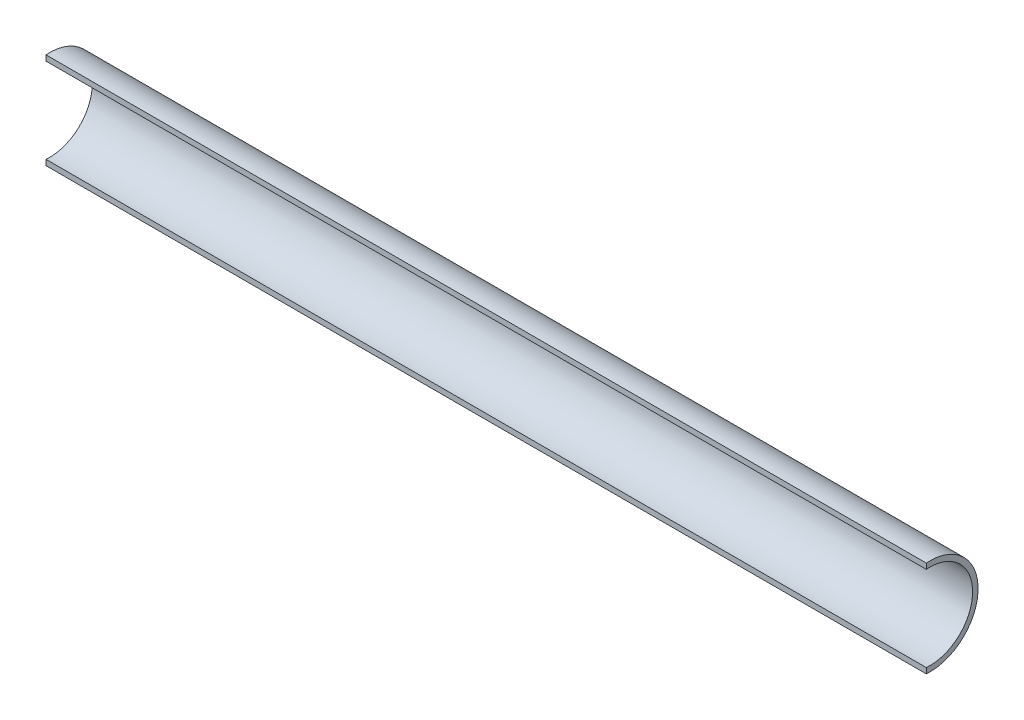
ISO-10303-21;
HEADER;
FILE_DESCRIPTION(('STEP AP214'),'2;1');
FILE_NAME('part.step','',(''),(''),'','','');
FILE_SCHEMA(('AUTOMOTIVE_DESIGN { 1 0 10303 214 1 1 1 1 }'));
ENDSEC;
DATA;
#1=APPLICATION_CONTEXT('core data for automotive mechanical design processes');
#2=APPLICATION_PROTOCOL_DEFINITION('international standard','automotive_design',2000,#1);
#3=PRODUCT_CONTEXT('',#1,'mechanical');
#4=PRODUCT('Part','Part','',(#3));
#5=PRODUCT_RELATED_PRODUCT_CATEGORY('part','',(#4));
#6=PRODUCT_DEFINITION_FORMATION('','',#4);
#7=PRODUCT_DEFINITION_CONTEXT('part definition',#1,'design');
#8=PRODUCT_DEFINITION('design','',#6,#7);
#9=PRODUCT_DEFINITION_SHAPE('','',#8);
#10=(LENGTH_UNIT() NAMED_UNIT(*) SI_UNIT(.MILLI.,.METRE.));
#11=(NAMED_UNIT(*) PLANE_ANGLE_UNIT() SI_UNIT($,.RADIAN.));
#12=(NAMED_UNIT(*) SI_UNIT($,.STERADIAN.) SOLID_ANGLE_UNIT());
#13=UNCERTAINTY_MEASURE_WITH_UNIT(LENGTH_MEASURE(1.E-05),#10,'distance_accuracy_value','');
#14=(GEOMETRIC_REPRESENTATION_CONTEXT(3) GLOBAL_UNCERTAINTY_ASSIGNED_CONTEXT((#13)) GLOBAL_UNIT_ASSIGNED_CONTEXT((#10,
#11,#12)) REPRESENTATION_CONTEXT('',''));
#15=CARTESIAN_POINT('',(0.,0.,0.));
#16=DIRECTION('',(0.,0.,1.));
#17=DIRECTION('',(1.,0.,0.));
#18=AXIS2_PLACEMENT_3D('',#15,#16,#17);
#19=CARTESIAN_POINT('',(0.,3.29210921294856,-0.0304629088389462));
#20=DIRECTION('',(0.,-1.,0.));
#21=DIRECTION('',(0.,0.,-1.));
#22=AXIS2_PLACEMENT_3D('',#19,#20,#21);
#23=PLANE('',#22);
#24=DIRECTION('',(0.,0.,-1.));
#25=VECTOR('',#24,1.);
#26=CARTESIAN_POINT('',(0.,3.29210921294856,-0.0304629088389462));
#27=LINE('',#26,#25);
#28=CARTESIAN_POINT('',(0.,3.29210921294856,0.));
#29=VERTEX_POINT('',#28);
#30=CARTESIAN_POINT('',(0.,3.29210921294856,-0.0304629088389495));
#31=VERTEX_POINT('',#30);
#32=EDGE_CURVE('E72',#29,#31,#27,.T.);
#33=ORIENTED_EDGE('',*,*,#32,.T.);
#34=DIRECTION('',(-1.,0.,0.));
#35=VECTOR('',#34,1.);
#36=CARTESIAN_POINT('',(0.,3.29210921294856,-0.0304629088389462));
#37=LINE('',#36,#35);
#38=CARTESIAN_POINT('',(32.,3.29210921294856,-0.0304629088389495));
#39=VERTEX_POINT('',#38);
#40=EDGE_CURVE('E70',#31,#39,#37,.F.);
#41=ORIENTED_EDGE('',*,*,#40,.T.);
#42=DIRECTION('',(0.,0.,-1.));
#43=VECTOR('',#42,1.);
#44=CARTESIAN_POINT('',(32.,3.29210921294856,-0.0304629088389462));
#45=LINE('',#44,#43);
#46=CARTESIAN_POINT('',(32.,3.29210921294856,0.));
#47=VERTEX_POINT('',#46);
#48=EDGE_CURVE('E61',#39,#47,#45,.F.);
#49=ORIENTED_EDGE('',*,*,#48,.T.);
#50=DIRECTION('',(1.,0.,0.));
#51=VECTOR('',#50,1.);
#52=CARTESIAN_POINT('',(0.,3.29210921294856,0.));
#53=LINE('',#52,#51);
#54=EDGE_CURVE('E67',#29,#47,#53,.T.);
#55=ORIENTED_EDGE('',*,*,#54,.F.);
#56=EDGE_LOOP('',(#33,#41,#49,#55));
#57=FACE_BOUND('',#56,.T.);
#58=ADVANCED_FACE('F17',(#57),#23,.T.);
#59=CARTESIAN_POINT('',(0.,1.74488781342552,-0.133665697017206));
#60=DIRECTION('',(-1.,0.,0.));
#61=DIRECTION('',(0.,0.,1.));
#62=AXIS2_PLACEMENT_3D('',#59,#60,#61);
#63=CYLINDRICAL_SURFACE('',#62,1.55065949667546);
#64=ORIENTED_EDGE('',*,*,#40,.F.);
#65=CARTESIAN_POINT('',(0.,1.74488781342552,-0.133665697017206));
#66=DIRECTION('',(-1.,0.,0.));
#67=DIRECTION('',(0.,0.,1.));
#68=AXIS2_PLACEMENT_3D('',#65,#66,#67);
#69=CIRCLE('',#68,1.55065949667546);
#70=CARTESIAN_POINT('',(0.,0.2,0.));
#71=VERTEX_POINT('',#70);
#72=EDGE_CURVE('E103',#71,#31,#69,.F.);
#73=ORIENTED_EDGE('',*,*,#72,.F.);
#74=DIRECTION('',(-1.,0.,0.));
#75=VECTOR('',#74,1.);
#76=CARTESIAN_POINT('',(0.,0.2,0.));
#77=LINE('',#76,#75);
#78=CARTESIAN_POINT('',(32.,0.2,0.));
#79=VERTEX_POINT('',#78);
#80=EDGE_CURVE('E86',#71,#79,#77,.F.);
#81=ORIENTED_EDGE('',*,*,#80,.T.);
#82=CARTESIAN_POINT('',(32.,1.74488781342552,-0.133665697017206));
#83=DIRECTION('',(-1.,0.,0.));
#84=DIRECTION('',(0.,0.,1.));
#85=AXIS2_PLACEMENT_3D('',#82,#83,#84);
#86=CIRCLE('',#85,1.55065949667546);
#87=EDGE_CURVE('E20',#39,#79,#86,.T.);
#88=ORIENTED_EDGE('',*,*,#87,.F.);
#89=EDGE_LOOP('',(#64,#73,#81,#88));
#90=FACE_BOUND('',#89,.T.);
#91=ADVANCED_FACE('F119',(#90),#63,.F.);
#92=CARTESIAN_POINT('',(0.,3.29210921294856,0.));
#93=DIRECTION('',(0.,-1.256067192182E-13,1.));
#94=DIRECTION('',(0.,-1.,-1.256067192182E-13));
#95=AXIS2_PLACEMENT_3D('',#92,#93,#94);
#96=PLANE('',#95);
#97=DIRECTION('',(0.,1.,0.));
#98=VECTOR('',#97,1.);
#99=CARTESIAN_POINT('',(0.,3.48977562685105,0.));
#100=LINE('',#99,#98);
#101=CARTESIAN_POINT('',(0.,3.48977562685105,0.));
#102=VERTEX_POINT('',#101);
#103=EDGE_CURVE('E79',#29,#102,#100,.T.);
#104=ORIENTED_EDGE('',*,*,#103,.F.);
#105=ORIENTED_EDGE('',*,*,#54,.T.);
#106=DIRECTION('',(0.,1.,0.));
#107=VECTOR('',#106,1.);
#108=CARTESIAN_POINT('',(32.,3.48977562685105,0.));
#109=LINE('',#108,#107);
#110=CARTESIAN_POINT('',(32.,3.48977562685105,0.));
#111=VERTEX_POINT('',#110);
#112=EDGE_CURVE('E76',#111,#47,#109,.F.);
#113=ORIENTED_EDGE('',*,*,#112,.F.);
#114=DIRECTION('',(-1.,0.,0.));
#115=VECTOR('',#114,1.);
#116=CARTESIAN_POINT('',(0.,3.48977562685105,0.));
#117=LINE('',#116,#115);
#118=EDGE_CURVE('E102',#102,#111,#117,.F.);
#119=ORIENTED_EDGE('',*,*,#118,.F.);
#120=EDGE_LOOP('',(#104,#105,#113,#119));
#121=FACE_BOUND('',#120,.T.);
#122=ADVANCED_FACE('F75',(#121),#96,.T.);
#123=CARTESIAN_POINT('',(32.,3.48977562685105,0.));
#124=DIRECTION('',(1.,0.,0.));
#125=DIRECTION('',(0.,0.,-1.));
#126=AXIS2_PLACEMENT_3D('',#123,#124,#125);
#127=PLANE('',#126);
#128=ORIENTED_EDGE('',*,*,#87,.T.);
#129=DIRECTION('',(0.,1.,0.));
#130=VECTOR('',#129,1.);
#131=CARTESIAN_POINT('',(32.,0.2,0.));
#132=LINE('',#131,#130);
#133=CARTESIAN_POINT('',(32.,0.,0.));
#134=VERTEX_POINT('',#133);
#135=EDGE_CURVE('E89',#79,#134,#132,.F.);
#136=ORIENTED_EDGE('',*,*,#135,.T.);
#137=CARTESIAN_POINT('',(32.,1.74488781342552,-0.133665697017206));
#138=DIRECTION('',(-1.,0.,0.));
#139=DIRECTION('',(0.,0.,1.));
#140=AXIS2_PLACEMENT_3D('',#137,#138,#139);
#141=CIRCLE('',#140,1.75);
#142=EDGE_CURVE('E83',#111,#134,#141,.T.);
#143=ORIENTED_EDGE('',*,*,#142,.F.);
#144=ORIENTED_EDGE('',*,*,#112,.T.);
#145=ORIENTED_EDGE('',*,*,#48,.F.);
#146=EDGE_LOOP('',(#128,#136,#143,#144,#145));
#147=FACE_BOUND('',#146,.T.);
#148=ADVANCED_FACE('F81',(#147),#127,.T.);
#149=CARTESIAN_POINT('',(0.,0.2,0.));
#150=DIRECTION('',(0.,0.,-1.));
#151=DIRECTION('',(-1.,0.,0.));
#152=AXIS2_PLACEMENT_3D('',#149,#150,#151);
#153=PLANE('',#152);
#154=DIRECTION('',(-1.,0.,0.));
#155=VECTOR('',#154,1.);
#156=CARTESIAN_POINT('',(0.,0.,0.));
#157=LINE('',#156,#155);
#158=CARTESIAN_POINT('',(0.,0.,0.));
#159=VERTEX_POINT('',#158);
#160=EDGE_CURVE('E26',#134,#159,#157,.T.);
#161=ORIENTED_EDGE('',*,*,#160,.F.);
#162=ORIENTED_EDGE('',*,*,#135,.F.);
#163=ORIENTED_EDGE('',*,*,#80,.F.);
#164=DIRECTION('',(0.,1.,0.));
#165=VECTOR('',#164,1.);
#166=CARTESIAN_POINT('',(0.,3.48977562685105,0.));
#167=LINE('',#166,#165);
#168=EDGE_CURVE('E35',#159,#71,#167,.T.);
#169=ORIENTED_EDGE('',*,*,#168,.F.);
#170=EDGE_LOOP('',(#161,#162,#163,#169));
#171=FACE_BOUND('',#170,.T.);
#172=ADVANCED_FACE('F110',(#171),#153,.F.);
#173=CARTESIAN_POINT('',(0.,3.48977562685105,0.));
#174=DIRECTION('',(-1.,0.,0.));
#175=DIRECTION('',(0.,0.,1.));
#176=AXIS2_PLACEMENT_3D('',#173,#174,#175);
#177=PLANE('',#176);
#178=CARTESIAN_POINT('',(0.,1.74488781342552,-0.133665697017206));
#179=DIRECTION('',(-1.,0.,0.));
#180=DIRECTION('',(0.,0.,1.));
#181=AXIS2_PLACEMENT_3D('',#178,#179,#180);
#182=CIRCLE('',#181,1.75);
#183=EDGE_CURVE('E11',#159,#102,#182,.F.);
#184=ORIENTED_EDGE('',*,*,#183,.F.);
#185=ORIENTED_EDGE('',*,*,#168,.T.);
#186=ORIENTED_EDGE('',*,*,#72,.T.);
#187=ORIENTED_EDGE('',*,*,#32,.F.);
#188=ORIENTED_EDGE('',*,*,#103,.T.);
#189=EDGE_LOOP('',(#184,#185,#186,#187,#188));
#190=FACE_BOUND('',#189,.T.);
#191=ADVANCED_FACE('F117',(#190),#177,.T.);
#192=CARTESIAN_POINT('',(0.,1.74488781342552,-0.133665697017206));
#193=DIRECTION('',(-1.,0.,0.));
#194=DIRECTION('',(0.,0.,1.));
#195=AXIS2_PLACEMENT_3D('',#192,#193,#194);
#196=CYLINDRICAL_SURFACE('',#195,1.75);
#197=ORIENTED_EDGE('',*,*,#160,.T.);
#198=ORIENTED_EDGE('',*,*,#183,.T.);
#199=ORIENTED_EDGE('',*,*,#118,.T.);
#200=ORIENTED_EDGE('',*,*,#142,.T.);
#201=EDGE_LOOP('',(#197,#198,#199,#200));
#202=FACE_BOUND('',#201,.T.);
#203=ADVANCED_FACE('F113',(#202),#196,.T.);
#204=CLOSED_SHELL('',(#58,#91,#122,#148,#172,#191,#203));
#205=MANIFOLD_SOLID_BREP('B1',#204);
#206=ADVANCED_BREP_SHAPE_REPRESENTATION('',(#18,#205),#14);
#207=SHAPE_DEFINITION_REPRESENTATION(#9,#206);
ENDSEC;
END-ISO-10303-21;
